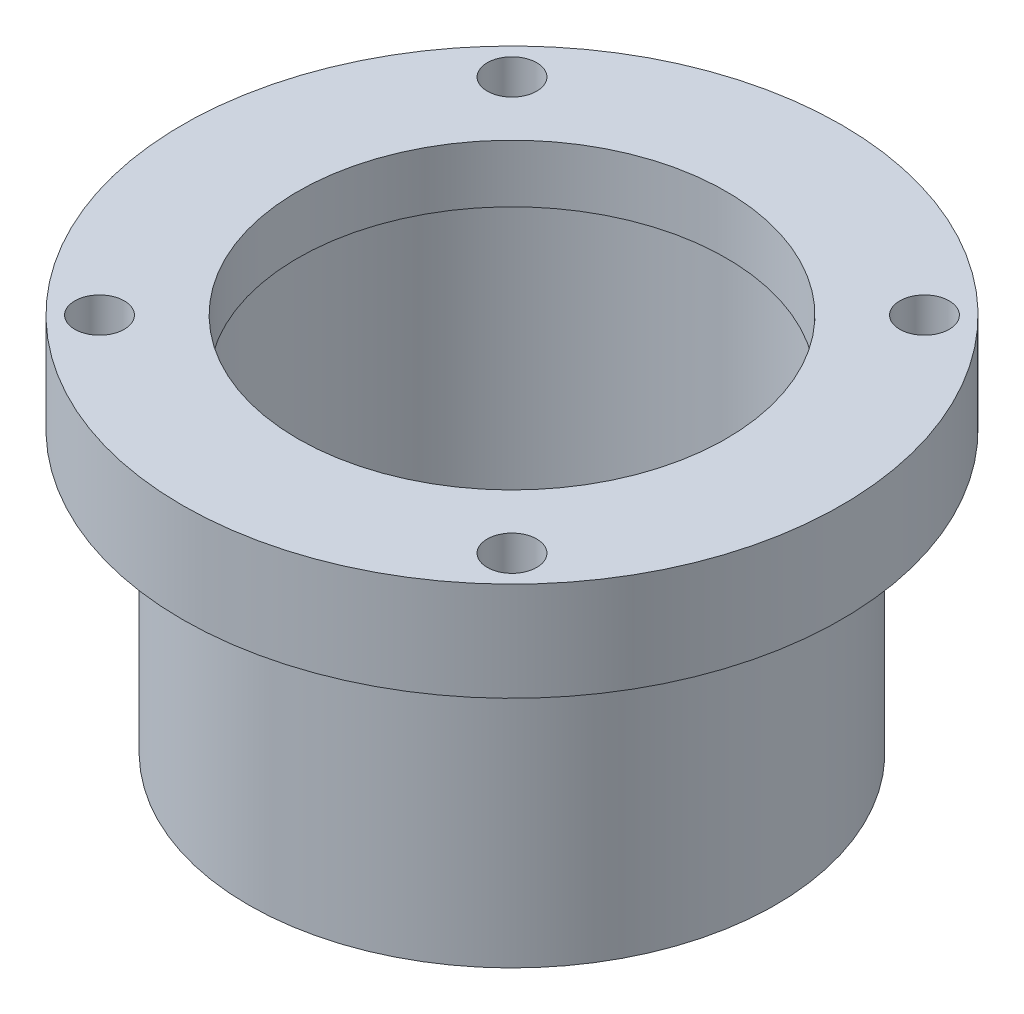
ISO-10303-21;
HEADER;
FILE_DESCRIPTION(('STEP AP214'),'2;1');
FILE_NAME('part.step','',(''),(''),'','','');
FILE_SCHEMA(('AUTOMOTIVE_DESIGN { 1 0 10303 214 1 1 1 1 }'));
ENDSEC;
DATA;
#1=APPLICATION_CONTEXT('core data for automotive mechanical design processes');
#2=APPLICATION_PROTOCOL_DEFINITION('international standard','automotive_design',2000,#1);
#3=PRODUCT_CONTEXT('',#1,'mechanical');
#4=PRODUCT('Part','Part','',(#3));
#5=PRODUCT_RELATED_PRODUCT_CATEGORY('part','',(#4));
#6=PRODUCT_DEFINITION_FORMATION('','',#4);
#7=PRODUCT_DEFINITION_CONTEXT('part definition',#1,'design');
#8=PRODUCT_DEFINITION('design','',#6,#7);
#9=PRODUCT_DEFINITION_SHAPE('','',#8);
#10=(LENGTH_UNIT() NAMED_UNIT(*) SI_UNIT(.MILLI.,.METRE.));
#11=(NAMED_UNIT(*) PLANE_ANGLE_UNIT() SI_UNIT($,.RADIAN.));
#12=(NAMED_UNIT(*) SI_UNIT($,.STERADIAN.) SOLID_ANGLE_UNIT());
#13=UNCERTAINTY_MEASURE_WITH_UNIT(LENGTH_MEASURE(1.E-05),#10,'distance_accuracy_value','');
#14=(GEOMETRIC_REPRESENTATION_CONTEXT(3) GLOBAL_UNCERTAINTY_ASSIGNED_CONTEXT((#13)) GLOBAL_UNIT_ASSIGNED_CONTEXT((#10,
#11,#12)) REPRESENTATION_CONTEXT('',''));
#15=CARTESIAN_POINT('',(0.,0.,0.));
#16=DIRECTION('',(0.,0.,1.));
#17=DIRECTION('',(1.,0.,0.));
#18=AXIS2_PLACEMENT_3D('',#15,#16,#17);
#19=CARTESIAN_POINT('',(-19.0091828831705,-220.5,-53.2448828787845));
#20=DIRECTION('',(0.,-1.,0.));
#21=DIRECTION('',(0.,0.,-1.));
#22=AXIS2_PLACEMENT_3D('',#19,#20,#21);
#23=CYLINDRICAL_SURFACE('',#22,16.);
#24=CARTESIAN_POINT('',(-19.0091828831705,-220.5,-53.2448828787845));
#25=DIRECTION('',(0.,1.,0.));
#26=DIRECTION('',(0.,0.,1.));
#27=AXIS2_PLACEMENT_3D('',#24,#25,#26);
#28=CIRCLE('',#27,16.);
#29=CARTESIAN_POINT('',(-19.0091828831705,-220.5,-37.2448828787845));
#30=VERTEX_POINT('',#29);
#31=EDGE_CURVE('E10',#30,#30,#28,.T.);
#32=ORIENTED_EDGE('',*,*,#31,.F.);
#33=EDGE_LOOP('',(#32));
#34=FACE_BOUND('',#33,.T.);
#35=CARTESIAN_POINT('',(-19.0091828831705,-237.5,-53.2448828787845));
#36=DIRECTION('',(0.,1.,0.));
#37=DIRECTION('',(0.,0.,1.));
#38=AXIS2_PLACEMENT_3D('',#35,#36,#37);
#39=CIRCLE('',#38,16.);
#40=CARTESIAN_POINT('',(-19.0091828831705,-237.5,-37.2448828787845));
#41=VERTEX_POINT('',#40);
#42=EDGE_CURVE('E46',#41,#41,#39,.T.);
#43=ORIENTED_EDGE('',*,*,#42,.T.);
#44=EDGE_LOOP('',(#43));
#45=FACE_BOUND('',#44,.T.);
#46=ADVANCED_FACE('F39',(#34,#45),#23,.T.);
#47=CARTESIAN_POINT('',(-19.0091828831705,-237.5,-53.2448828787845));
#48=DIRECTION('',(0.,1.,0.));
#49=DIRECTION('',(0.,0.,1.));
#50=AXIS2_PLACEMENT_3D('',#47,#48,#49);
#51=PLANE('',#50);
#52=CARTESIAN_POINT('',(-19.0091828831705,-237.5,-53.2448828787845));
#53=DIRECTION('',(0.,1.,0.));
#54=DIRECTION('',(0.,0.,1.));
#55=AXIS2_PLACEMENT_3D('',#52,#53,#54);
#56=CIRCLE('',#55,14.);
#57=CARTESIAN_POINT('',(-19.0091828831705,-237.5,-39.2448828787845));
#58=VERTEX_POINT('',#57);
#59=EDGE_CURVE('E60',#58,#58,#56,.F.);
#60=ORIENTED_EDGE('',*,*,#59,.F.);
#61=EDGE_LOOP('',(#60));
#62=FACE_BOUND('',#61,.T.);
#63=ORIENTED_EDGE('',*,*,#42,.F.);
#64=EDGE_LOOP('',(#63));
#65=FACE_BOUND('',#64,.T.);
#66=ADVANCED_FACE('F118',(#62,#65),#51,.F.);
#67=CARTESIAN_POINT('',(-19.0091828831705,-214.5,-53.2448828787845));
#68=DIRECTION('',(0.,-1.,0.));
#69=DIRECTION('',(0.,0.,-1.));
#70=AXIS2_PLACEMENT_3D('',#67,#68,#69);
#71=CYLINDRICAL_SURFACE('',#70,20.);
#72=CARTESIAN_POINT('',(-19.0091828831705,-214.5,-53.2448828787845));
#73=DIRECTION('',(0.,1.,0.));
#74=DIRECTION('',(0.,0.,1.));
#75=AXIS2_PLACEMENT_3D('',#72,#73,#74);
#76=CIRCLE('',#75,20.);
#77=CARTESIAN_POINT('',(-19.0091828831705,-214.5,-33.2448828787845));
#78=VERTEX_POINT('',#77);
#79=EDGE_CURVE('E51',#78,#78,#76,.T.);
#80=ORIENTED_EDGE('',*,*,#79,.F.);
#81=EDGE_LOOP('',(#80));
#82=FACE_BOUND('',#81,.T.);
#83=CARTESIAN_POINT('',(-19.0091828831705,-220.5,-53.2448828787845));
#84=DIRECTION('',(0.,1.,0.));
#85=DIRECTION('',(0.,0.,1.));
#86=AXIS2_PLACEMENT_3D('',#83,#84,#85);
#87=CIRCLE('',#86,20.);
#88=CARTESIAN_POINT('',(-19.0091828831705,-220.5,-33.2448828787845));
#89=VERTEX_POINT('',#88);
#90=EDGE_CURVE('E53',#89,#89,#87,.T.);
#91=ORIENTED_EDGE('',*,*,#90,.T.);
#92=EDGE_LOOP('',(#91));
#93=FACE_BOUND('',#92,.T.);
#94=ADVANCED_FACE('F97',(#82,#93),#71,.T.);
#95=CARTESIAN_POINT('',(-19.0091828831705,-214.5,-53.2448828787845));
#96=DIRECTION('',(0.,1.,0.));
#97=DIRECTION('',(0.,0.,1.));
#98=AXIS2_PLACEMENT_3D('',#95,#96,#97);
#99=PLANE('',#98);
#100=CARTESIAN_POINT('',(-6.49339285616864,-214.5,-65.7606729057864));
#101=DIRECTION('',(0.,1.,0.));
#102=DIRECTION('',(0.,0.,1.));
#103=AXIS2_PLACEMENT_3D('',#100,#101,#102);
#104=CIRCLE('',#103,1.5);
#105=CARTESIAN_POINT('',(-6.49339285616864,-214.5,-64.2606729057864));
#106=VERTEX_POINT('',#105);
#107=EDGE_CURVE('E83',#106,#106,#104,.F.);
#108=ORIENTED_EDGE('',*,*,#107,.T.);
#109=EDGE_LOOP('',(#108));
#110=FACE_BOUND('',#109,.T.);
#111=CARTESIAN_POINT('',(-31.5249729101724,-214.5,-65.7606729057864));
#112=DIRECTION('',(0.,1.,0.));
#113=DIRECTION('',(0.,0.,1.));
#114=AXIS2_PLACEMENT_3D('',#111,#112,#113);
#115=CIRCLE('',#114,1.5);
#116=CARTESIAN_POINT('',(-31.5249729101724,-214.5,-64.2606729057864));
#117=VERTEX_POINT('',#116);
#118=EDGE_CURVE('E72',#117,#117,#115,.F.);
#119=ORIENTED_EDGE('',*,*,#118,.T.);
#120=EDGE_LOOP('',(#119));
#121=FACE_BOUND('',#120,.T.);
#122=CARTESIAN_POINT('',(-31.5249729101724,-214.5,-40.7290928517826));
#123=DIRECTION('',(0.,1.,0.));
#124=DIRECTION('',(0.,0.,1.));
#125=AXIS2_PLACEMENT_3D('',#122,#123,#124);
#126=CIRCLE('',#125,1.5);
#127=CARTESIAN_POINT('',(-31.5249729101724,-214.5,-39.2290928517826));
#128=VERTEX_POINT('',#127);
#129=EDGE_CURVE('E73',#128,#128,#126,.F.);
#130=ORIENTED_EDGE('',*,*,#129,.T.);
#131=EDGE_LOOP('',(#130));
#132=FACE_BOUND('',#131,.T.);
#133=CARTESIAN_POINT('',(-6.49339285616864,-214.5,-40.7290928517826));
#134=DIRECTION('',(0.,1.,0.));
#135=DIRECTION('',(0.,0.,1.));
#136=AXIS2_PLACEMENT_3D('',#133,#134,#135);
#137=CIRCLE('',#136,1.5);
#138=CARTESIAN_POINT('',(-6.49339285616864,-214.5,-39.2290928517826));
#139=VERTEX_POINT('',#138);
#140=EDGE_CURVE('E68',#139,#139,#137,.F.);
#141=ORIENTED_EDGE('',*,*,#140,.T.);
#142=EDGE_LOOP('',(#141));
#143=FACE_BOUND('',#142,.T.);
#144=CARTESIAN_POINT('',(-19.0091828831705,-214.5,-53.2448828787845));
#145=DIRECTION('',(0.,1.,0.));
#146=DIRECTION('',(0.,0.,1.));
#147=AXIS2_PLACEMENT_3D('',#144,#145,#146);
#148=CIRCLE('',#147,13.);
#149=CARTESIAN_POINT('',(-19.0091828831705,-214.5,-40.2448828787845));
#150=VERTEX_POINT('',#149);
#151=EDGE_CURVE('E62',#150,#150,#148,.F.);
#152=ORIENTED_EDGE('',*,*,#151,.T.);
#153=EDGE_LOOP('',(#152));
#154=FACE_BOUND('',#153,.T.);
#155=ORIENTED_EDGE('',*,*,#79,.T.);
#156=EDGE_LOOP('',(#155));
#157=FACE_BOUND('',#156,.T.);
#158=ADVANCED_FACE('F105',(#110,#121,#132,#143,#154,#157),#99,.T.);
#159=CARTESIAN_POINT('',(-19.0091828831705,-220.5,-53.2448828787845));
#160=DIRECTION('',(0.,1.,0.));
#161=DIRECTION('',(0.,0.,1.));
#162=AXIS2_PLACEMENT_3D('',#159,#160,#161);
#163=PLANE('',#162);
#164=CARTESIAN_POINT('',(-6.49339285616864,-220.5,-65.7606729057864));
#165=DIRECTION('',(0.,1.,0.));
#166=DIRECTION('',(0.,0.,1.));
#167=AXIS2_PLACEMENT_3D('',#164,#165,#166);
#168=CIRCLE('',#167,1.5);
#169=CARTESIAN_POINT('',(-6.49339285616864,-220.5,-64.2606729057864));
#170=VERTEX_POINT('',#169);
#171=EDGE_CURVE('E45',#170,#170,#168,.F.);
#172=ORIENTED_EDGE('',*,*,#171,.F.);
#173=EDGE_LOOP('',(#172));
#174=FACE_BOUND('',#173,.T.);
#175=CARTESIAN_POINT('',(-31.5249729101724,-220.5,-65.7606729057864));
#176=DIRECTION('',(0.,1.,0.));
#177=DIRECTION('',(0.,0.,1.));
#178=AXIS2_PLACEMENT_3D('',#175,#176,#177);
#179=CIRCLE('',#178,1.5);
#180=CARTESIAN_POINT('',(-31.5249729101724,-220.5,-64.2606729057864));
#181=VERTEX_POINT('',#180);
#182=EDGE_CURVE('E75',#181,#181,#179,.F.);
#183=ORIENTED_EDGE('',*,*,#182,.F.);
#184=EDGE_LOOP('',(#183));
#185=FACE_BOUND('',#184,.T.);
#186=CARTESIAN_POINT('',(-31.5249729101724,-220.5,-40.7290928517826));
#187=DIRECTION('',(0.,1.,0.));
#188=DIRECTION('',(0.,0.,1.));
#189=AXIS2_PLACEMENT_3D('',#186,#187,#188);
#190=CIRCLE('',#189,1.5);
#191=CARTESIAN_POINT('',(-31.5249729101724,-220.5,-39.2290928517826));
#192=VERTEX_POINT('',#191);
#193=EDGE_CURVE('E67',#192,#192,#190,.F.);
#194=ORIENTED_EDGE('',*,*,#193,.F.);
#195=EDGE_LOOP('',(#194));
#196=FACE_BOUND('',#195,.T.);
#197=CARTESIAN_POINT('',(-6.49339285616864,-220.5,-40.7290928517826));
#198=DIRECTION('',(0.,1.,0.));
#199=DIRECTION('',(0.,0.,1.));
#200=AXIS2_PLACEMENT_3D('',#197,#198,#199);
#201=CIRCLE('',#200,1.5);
#202=CARTESIAN_POINT('',(-6.49339285616864,-220.5,-39.2290928517826));
#203=VERTEX_POINT('',#202);
#204=EDGE_CURVE('E63',#203,#203,#201,.F.);
#205=ORIENTED_EDGE('',*,*,#204,.F.);
#206=EDGE_LOOP('',(#205));
#207=FACE_BOUND('',#206,.T.);
#208=ORIENTED_EDGE('',*,*,#31,.T.);
#209=EDGE_LOOP('',(#208));
#210=FACE_BOUND('',#209,.T.);
#211=ORIENTED_EDGE('',*,*,#90,.F.);
#212=EDGE_LOOP('',(#211));
#213=FACE_BOUND('',#212,.T.);
#214=ADVANCED_FACE('F100',(#174,#185,#196,#207,#210,#213),#163,.F.);
#215=CARTESIAN_POINT('',(-19.0091828831705,-218.,-53.2448828787845));
#216=DIRECTION('',(0.,-1.,0.));
#217=DIRECTION('',(0.,0.,-1.));
#218=AXIS2_PLACEMENT_3D('',#215,#216,#217);
#219=CYLINDRICAL_SURFACE('',#218,14.);
#220=CARTESIAN_POINT('',(-19.0091828831705,-218.,-53.2448828787845));
#221=DIRECTION('',(0.,1.,0.));
#222=DIRECTION('',(0.,0.,1.));
#223=AXIS2_PLACEMENT_3D('',#220,#221,#222);
#224=CIRCLE('',#223,14.);
#225=CARTESIAN_POINT('',(-19.0091828831705,-218.,-39.2448828787845));
#226=VERTEX_POINT('',#225);
#227=EDGE_CURVE('E58',#226,#226,#224,.T.);
#228=ORIENTED_EDGE('',*,*,#227,.T.);
#229=EDGE_LOOP('',(#228));
#230=FACE_BOUND('',#229,.T.);
#231=ORIENTED_EDGE('',*,*,#59,.T.);
#232=EDGE_LOOP('',(#231));
#233=FACE_BOUND('',#232,.T.);
#234=ADVANCED_FACE('F103',(#230,#233),#219,.F.);
#235=CARTESIAN_POINT('',(-19.0091828831705,-218.,-53.2448828787845));
#236=DIRECTION('',(0.,1.,0.));
#237=DIRECTION('',(0.,0.,1.));
#238=AXIS2_PLACEMENT_3D('',#235,#236,#237);
#239=PLANE('',#238);
#240=CARTESIAN_POINT('',(-19.0091828831705,-218.,-53.2448828787845));
#241=DIRECTION('',(0.,1.,0.));
#242=DIRECTION('',(0.,0.,1.));
#243=AXIS2_PLACEMENT_3D('',#240,#241,#242);
#244=CIRCLE('',#243,13.);
#245=CARTESIAN_POINT('',(-19.0091828831705,-218.,-40.2448828787845));
#246=VERTEX_POINT('',#245);
#247=EDGE_CURVE('E61',#246,#246,#244,.T.);
#248=ORIENTED_EDGE('',*,*,#247,.T.);
#249=EDGE_LOOP('',(#248));
#250=FACE_BOUND('',#249,.T.);
#251=ORIENTED_EDGE('',*,*,#227,.F.);
#252=EDGE_LOOP('',(#251));
#253=FACE_BOUND('',#252,.T.);
#254=ADVANCED_FACE('F109',(#250,#253),#239,.F.);
#255=CARTESIAN_POINT('',(-19.0091828831705,-214.4,-53.2448828787845));
#256=DIRECTION('',(0.,-1.,0.));
#257=DIRECTION('',(0.,0.,-1.));
#258=AXIS2_PLACEMENT_3D('',#255,#256,#257);
#259=CYLINDRICAL_SURFACE('',#258,13.);
#260=ORIENTED_EDGE('',*,*,#151,.F.);
#261=EDGE_LOOP('',(#260));
#262=FACE_BOUND('',#261,.T.);
#263=ORIENTED_EDGE('',*,*,#247,.F.);
#264=EDGE_LOOP('',(#263));
#265=FACE_BOUND('',#264,.T.);
#266=ADVANCED_FACE('F168',(#262,#265),#259,.F.);
#267=CARTESIAN_POINT('',(-6.49339285616864,-214.4,-40.7290928517826));
#268=DIRECTION('',(0.,-1.,0.));
#269=DIRECTION('',(0.,0.,-1.));
#270=AXIS2_PLACEMENT_3D('',#267,#268,#269);
#271=CYLINDRICAL_SURFACE('',#270,1.5);
#272=ORIENTED_EDGE('',*,*,#140,.F.);
#273=EDGE_LOOP('',(#272));
#274=FACE_BOUND('',#273,.T.);
#275=ORIENTED_EDGE('',*,*,#204,.T.);
#276=EDGE_LOOP('',(#275));
#277=FACE_BOUND('',#276,.T.);
#278=ADVANCED_FACE('F174',(#274,#277),#271,.F.);
#279=CARTESIAN_POINT('',(-31.5249729101724,-214.4,-40.7290928517826));
#280=DIRECTION('',(0.,-1.,0.));
#281=DIRECTION('',(0.,0.,-1.));
#282=AXIS2_PLACEMENT_3D('',#279,#280,#281);
#283=CYLINDRICAL_SURFACE('',#282,1.5);
#284=ORIENTED_EDGE('',*,*,#129,.F.);
#285=EDGE_LOOP('',(#284));
#286=FACE_BOUND('',#285,.T.);
#287=ORIENTED_EDGE('',*,*,#193,.T.);
#288=EDGE_LOOP('',(#287));
#289=FACE_BOUND('',#288,.T.);
#290=ADVANCED_FACE('F183',(#286,#289),#283,.F.);
#291=CARTESIAN_POINT('',(-31.5249729101724,-214.4,-65.7606729057864));
#292=DIRECTION('',(0.,-1.,0.));
#293=DIRECTION('',(0.,0.,-1.));
#294=AXIS2_PLACEMENT_3D('',#291,#292,#293);
#295=CYLINDRICAL_SURFACE('',#294,1.5);
#296=ORIENTED_EDGE('',*,*,#118,.F.);
#297=EDGE_LOOP('',(#296));
#298=FACE_BOUND('',#297,.T.);
#299=ORIENTED_EDGE('',*,*,#182,.T.);
#300=EDGE_LOOP('',(#299));
#301=FACE_BOUND('',#300,.T.);
#302=ADVANCED_FACE('F191',(#298,#301),#295,.F.);
#303=CARTESIAN_POINT('',(-6.49339285616864,-214.4,-65.7606729057864));
#304=DIRECTION('',(0.,-1.,0.));
#305=DIRECTION('',(0.,0.,-1.));
#306=AXIS2_PLACEMENT_3D('',#303,#304,#305);
#307=CYLINDRICAL_SURFACE('',#306,1.5);
#308=ORIENTED_EDGE('',*,*,#107,.F.);
#309=EDGE_LOOP('',(#308));
#310=FACE_BOUND('',#309,.T.);
#311=ORIENTED_EDGE('',*,*,#171,.T.);
#312=EDGE_LOOP('',(#311));
#313=FACE_BOUND('',#312,.T.);
#314=ADVANCED_FACE('F202',(#310,#313),#307,.F.);
#315=CLOSED_SHELL('',(#46,#66,#94,#158,#214,#234,#254,#266,#278,#290,#302,#314));
#316=MANIFOLD_SOLID_BREP('B2',#315);
#317=ADVANCED_BREP_SHAPE_REPRESENTATION('',(#18,#316),#14);
#318=SHAPE_DEFINITION_REPRESENTATION(#9,#317);
ENDSEC;
END-ISO-10303-21;
